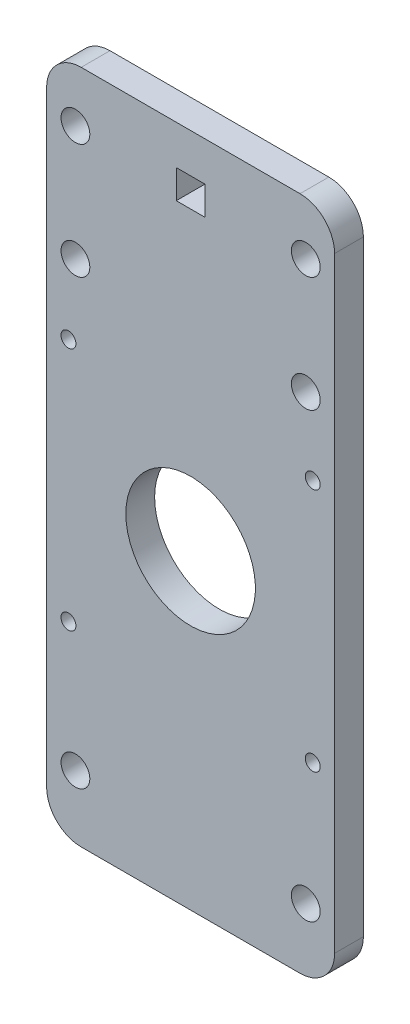
ISO-10303-21;
HEADER;
FILE_DESCRIPTION(('STEP AP214'),'2;1');
FILE_NAME('part.step','',(''),(''),'','','');
FILE_SCHEMA(('AUTOMOTIVE_DESIGN { 1 0 10303 214 1 1 1 1 }'));
ENDSEC;
DATA;
#1=APPLICATION_CONTEXT('core data for automotive mechanical design processes');
#2=APPLICATION_PROTOCOL_DEFINITION('international standard','automotive_design',2000,#1);
#3=PRODUCT_CONTEXT('',#1,'mechanical');
#4=PRODUCT('Part','Part','',(#3));
#5=PRODUCT_RELATED_PRODUCT_CATEGORY('part','',(#4));
#6=PRODUCT_DEFINITION_FORMATION('','',#4);
#7=PRODUCT_DEFINITION_CONTEXT('part definition',#1,'design');
#8=PRODUCT_DEFINITION('design','',#6,#7);
#9=PRODUCT_DEFINITION_SHAPE('','',#8);
#10=(LENGTH_UNIT() NAMED_UNIT(*) SI_UNIT(.MILLI.,.METRE.));
#11=(NAMED_UNIT(*) PLANE_ANGLE_UNIT() SI_UNIT($,.RADIAN.));
#12=(NAMED_UNIT(*) SI_UNIT($,.STERADIAN.) SOLID_ANGLE_UNIT());
#13=UNCERTAINTY_MEASURE_WITH_UNIT(LENGTH_MEASURE(1.E-05),#10,'distance_accuracy_value','');
#14=(GEOMETRIC_REPRESENTATION_CONTEXT(3) GLOBAL_UNCERTAINTY_ASSIGNED_CONTEXT((#13)) GLOBAL_UNIT_ASSIGNED_CONTEXT((#10,
#11,#12)) REPRESENTATION_CONTEXT('',''));
#15=CARTESIAN_POINT('',(0.,0.,0.));
#16=DIRECTION('',(0.,0.,1.));
#17=DIRECTION('',(1.,0.,0.));
#18=AXIS2_PLACEMENT_3D('',#15,#16,#17);
#19=CARTESIAN_POINT('',(-18.1,-22.0973062704397,-6.35));
#20=DIRECTION('',(0.,0.,-1.));
#21=DIRECTION('',(-1.,0.,0.));
#22=AXIS2_PLACEMENT_3D('',#19,#20,#21);
#23=PLANE('',#22);
#24=CARTESIAN_POINT('',(-26.9400000000001,44.8247845003733,-6.35));
#25=DIRECTION('',(0.,0.,1.));
#26=DIRECTION('',(1.,0.,0.));
#27=AXIS2_PLACEMENT_3D('',#24,#25,#26);
#28=CIRCLE('',#27,1.65);
#29=CARTESIAN_POINT('',(-25.2900000000001,44.8247845003733,-6.35));
#30=VERTEX_POINT('',#29);
#31=EDGE_CURVE('E575',#30,#30,#28,.T.);
#32=ORIENTED_EDGE('',*,*,#31,.T.);
#33=EDGE_LOOP('',(#32));
#34=FACE_BOUND('',#33,.T.);
#35=CARTESIAN_POINT('',(26.9400000000003,-9.05598381762616,-6.35));
#36=DIRECTION('',(0.,0.,1.));
#37=DIRECTION('',(1.,0.,0.));
#38=AXIS2_PLACEMENT_3D('',#35,#36,#37);
#39=CIRCLE('',#38,1.65);
#40=CARTESIAN_POINT('',(28.5900000000003,-9.05598381762616,-6.35));
#41=VERTEX_POINT('',#40);
#42=EDGE_CURVE('E587',#41,#41,#39,.T.);
#43=ORIENTED_EDGE('',*,*,#42,.T.);
#44=EDGE_LOOP('',(#43));
#45=FACE_BOUND('',#44,.T.);
#46=CARTESIAN_POINT('',(-26.9399999999997,-9.05598381762672,-6.35));
#47=DIRECTION('',(0.,0.,1.));
#48=DIRECTION('',(1.,0.,0.));
#49=AXIS2_PLACEMENT_3D('',#46,#47,#48);
#50=CIRCLE('',#49,1.65);
#51=CARTESIAN_POINT('',(-25.2899999999997,-9.05598381762672,-6.35));
#52=VERTEX_POINT('',#51);
#53=EDGE_CURVE('E581',#52,#52,#50,.T.);
#54=ORIENTED_EDGE('',*,*,#53,.T.);
#55=EDGE_LOOP('',(#54));
#56=FACE_BOUND('',#55,.T.);
#57=CARTESIAN_POINT('',(26.9399999999999,44.8247845003738,-6.35));
#58=DIRECTION('',(0.,0.,1.));
#59=DIRECTION('',(1.,0.,0.));
#60=AXIS2_PLACEMENT_3D('',#57,#58,#59);
#61=CIRCLE('',#60,1.65);
#62=CARTESIAN_POINT('',(28.5899999999999,44.8247845003738,-6.35));
#63=VERTEX_POINT('',#62);
#64=EDGE_CURVE('E569',#63,#63,#61,.T.);
#65=ORIENTED_EDGE('',*,*,#64,.T.);
#66=EDGE_LOOP('',(#65));
#67=FACE_BOUND('',#66,.T.);
#68=CARTESIAN_POINT('',(0.,17.8847845003735,-6.35));
#69=DIRECTION('',(0.,0.,-1.));
#70=DIRECTION('',(-1.,0.,0.));
#71=AXIS2_PLACEMENT_3D('',#68,#69,#70);
#72=CIRCLE('',#71,14.2875);
#73=CARTESIAN_POINT('',(-14.2875,17.8847845003735,-6.35));
#74=VERTEX_POINT('',#73);
#75=EDGE_CURVE('E172',#74,#74,#72,.T.);
#76=ORIENTED_EDGE('',*,*,#75,.F.);
#77=EDGE_LOOP('',(#76));
#78=FACE_BOUND('',#77,.T.);
#79=CARTESIAN_POINT('',(-25.4000000000007,-36.7252154996265,-6.35));
#80=DIRECTION('',(0.,0.,-1.));
#81=DIRECTION('',(-1.,0.,0.));
#82=AXIS2_PLACEMENT_3D('',#79,#80,#81);
#83=CIRCLE('',#82,3.175);
#84=CARTESIAN_POINT('',(-28.5750000000007,-36.7252154996265,-6.35));
#85=VERTEX_POINT('',#84);
#86=EDGE_CURVE('E178',#85,#85,#83,.T.);
#87=ORIENTED_EDGE('',*,*,#86,.F.);
#88=EDGE_LOOP('',(#87));
#89=FACE_BOUND('',#88,.T.);
#90=CARTESIAN_POINT('',(25.3999999999993,-36.7252154996269,-6.35));
#91=DIRECTION('',(0.,0.,-1.));
#92=DIRECTION('',(-1.,0.,0.));
#93=AXIS2_PLACEMENT_3D('',#90,#91,#92);
#94=CIRCLE('',#93,3.175);
#95=CARTESIAN_POINT('',(22.2249999999993,-36.7252154996269,-6.35));
#96=VERTEX_POINT('',#95);
#97=EDGE_CURVE('E184',#96,#96,#94,.T.);
#98=ORIENTED_EDGE('',*,*,#97,.F.);
#99=EDGE_LOOP('',(#98));
#100=FACE_BOUND('',#99,.T.);
#101=DIRECTION('',(-1.,0.,0.));
#102=VECTOR('',#101,1.);
#103=CARTESIAN_POINT('',(31.75,-50.6952154996265,-6.35));
#104=LINE('',#103,#102);
#105=CARTESIAN_POINT('',(24.13,-50.6952154996265,-6.35));
#106=VERTEX_POINT('',#105);
#107=CARTESIAN_POINT('',(-24.13,-50.6952154996265,-6.35));
#108=VERTEX_POINT('',#107);
#109=EDGE_CURVE('E197',#106,#108,#104,.T.);
#110=ORIENTED_EDGE('',*,*,#109,.T.);
#111=CARTESIAN_POINT('',(-24.13,-43.0752154996265,-6.35));
#112=DIRECTION('',(0.,0.,-1.));
#113=DIRECTION('',(-1.,0.,0.));
#114=AXIS2_PLACEMENT_3D('',#111,#112,#113);
#115=CIRCLE('',#114,7.62);
#116=CARTESIAN_POINT('',(-31.75,-43.0752154996265,-6.35));
#117=VERTEX_POINT('',#116);
#118=EDGE_CURVE('E221',#108,#117,#115,.T.);
#119=ORIENTED_EDGE('',*,*,#118,.T.);
#120=DIRECTION('',(0.,1.,0.));
#121=VECTOR('',#120,1.);
#122=CARTESIAN_POINT('',(-31.75,38.2047845003735,-6.35));
#123=LINE('',#122,#121);
#124=CARTESIAN_POINT('',(-31.75,90.5847845003735,-6.35));
#125=VERTEX_POINT('',#124);
#126=EDGE_CURVE('E190',#117,#125,#123,.T.);
#127=ORIENTED_EDGE('',*,*,#126,.T.);
#128=CARTESIAN_POINT('',(-24.13,90.5847845003735,-6.35));
#129=DIRECTION('',(0.,0.,-1.));
#130=DIRECTION('',(-1.,0.,0.));
#131=AXIS2_PLACEMENT_3D('',#128,#129,#130);
#132=CIRCLE('',#131,7.62);
#133=CARTESIAN_POINT('',(-24.13,98.2047845003734,-6.35));
#134=VERTEX_POINT('',#133);
#135=EDGE_CURVE('E217',#125,#134,#132,.T.);
#136=ORIENTED_EDGE('',*,*,#135,.T.);
#137=DIRECTION('',(1.,0.,0.));
#138=VECTOR('',#137,1.);
#139=CARTESIAN_POINT('',(31.75,98.2047845003734,-6.35));
#140=LINE('',#139,#138);
#141=CARTESIAN_POINT('',(24.13,98.2047845003734,-6.35));
#142=VERTEX_POINT('',#141);
#143=EDGE_CURVE('E166',#134,#142,#140,.T.);
#144=ORIENTED_EDGE('',*,*,#143,.T.);
#145=CARTESIAN_POINT('',(24.13,90.5847845003735,-6.35));
#146=DIRECTION('',(0.,0.,-1.));
#147=DIRECTION('',(-1.,0.,0.));
#148=AXIS2_PLACEMENT_3D('',#145,#146,#147);
#149=CIRCLE('',#148,7.62);
#150=CARTESIAN_POINT('',(31.75,90.5847845003735,-6.35));
#151=VERTEX_POINT('',#150);
#152=EDGE_CURVE('E215',#142,#151,#149,.T.);
#153=ORIENTED_EDGE('',*,*,#152,.T.);
#154=DIRECTION('',(0.,-1.,0.));
#155=VECTOR('',#154,1.);
#156=CARTESIAN_POINT('',(31.75,38.2047845003735,-6.35));
#157=LINE('',#156,#155);
#158=CARTESIAN_POINT('',(31.75,-43.0752154996265,-6.35));
#159=VERTEX_POINT('',#158);
#160=EDGE_CURVE('E206',#151,#159,#157,.T.);
#161=ORIENTED_EDGE('',*,*,#160,.T.);
#162=CARTESIAN_POINT('',(24.13,-43.0752154996265,-6.35));
#163=DIRECTION('',(0.,0.,-1.));
#164=DIRECTION('',(-1.,0.,0.));
#165=AXIS2_PLACEMENT_3D('',#162,#163,#164);
#166=CIRCLE('',#165,7.62);
#167=EDGE_CURVE('E219',#159,#106,#166,.T.);
#168=ORIENTED_EDGE('',*,*,#167,.T.);
#169=EDGE_LOOP('',(#110,#119,#127,#136,#144,#153,#161,#168));
#170=FACE_BOUND('',#169,.T.);
#171=CARTESIAN_POINT('',(-25.4,86.3797845003735,-6.35));
#172=DIRECTION('',(0.,0.,-1.));
#173=DIRECTION('',(1.,0.,0.));
#174=AXIS2_PLACEMENT_3D('',#171,#172,#173);
#175=CIRCLE('',#174,3.175);
#176=CARTESIAN_POINT('',(-22.225,86.3797845003735,-6.35));
#177=VERTEX_POINT('',#176);
#178=EDGE_CURVE('E566',#177,#177,#175,.T.);
#179=ORIENTED_EDGE('',*,*,#178,.F.);
#180=EDGE_LOOP('',(#179));
#181=FACE_BOUND('',#180,.T.);
#182=CARTESIAN_POINT('',(25.3999999999997,60.9797845003735,-6.35));
#183=DIRECTION('',(0.,0.,-1.));
#184=DIRECTION('',(-1.,0.,0.));
#185=AXIS2_PLACEMENT_3D('',#182,#183,#184);
#186=CIRCLE('',#185,3.175);
#187=CARTESIAN_POINT('',(22.2249999999997,60.9797845003735,-6.35));
#188=VERTEX_POINT('',#187);
#189=EDGE_CURVE('E560',#188,#188,#186,.T.);
#190=ORIENTED_EDGE('',*,*,#189,.F.);
#191=EDGE_LOOP('',(#190));
#192=FACE_BOUND('',#191,.T.);
#193=CARTESIAN_POINT('',(-25.3999999999997,60.9797845003735,-6.35));
#194=DIRECTION('',(0.,0.,-1.));
#195=DIRECTION('',(1.,0.,0.));
#196=AXIS2_PLACEMENT_3D('',#193,#194,#195);
#197=CIRCLE('',#196,3.175);
#198=CARTESIAN_POINT('',(-22.2249999999997,60.9797845003735,-6.35));
#199=VERTEX_POINT('',#198);
#200=EDGE_CURVE('E552',#199,#199,#197,.T.);
#201=ORIENTED_EDGE('',*,*,#200,.F.);
#202=EDGE_LOOP('',(#201));
#203=FACE_BOUND('',#202,.T.);
#204=CARTESIAN_POINT('',(25.4,86.3797845003735,-6.35));
#205=DIRECTION('',(0.,0.,-1.));
#206=DIRECTION('',(-1.,0.,0.));
#207=AXIS2_PLACEMENT_3D('',#204,#205,#206);
#208=CIRCLE('',#207,3.175);
#209=CARTESIAN_POINT('',(22.225,86.3797845003735,-6.35));
#210=VERTEX_POINT('',#209);
#211=EDGE_CURVE('E153',#210,#210,#208,.T.);
#212=ORIENTED_EDGE('',*,*,#211,.F.);
#213=EDGE_LOOP('',(#212));
#214=FACE_BOUND('',#213,.T.);
#215=DIRECTION('',(-1.,0.,0.));
#216=VECTOR('',#215,1.);
#217=CARTESIAN_POINT('',(-3.165,83.2147845003735,-6.35));
#218=LINE('',#217,#216);
#219=CARTESIAN_POINT('',(3.165,83.2147845003735,-6.35));
#220=VERTEX_POINT('',#219);
#221=CARTESIAN_POINT('',(-3.165,83.2147845003735,-6.35));
#222=VERTEX_POINT('',#221);
#223=EDGE_CURVE('E159',#220,#222,#218,.T.);
#224=ORIENTED_EDGE('',*,*,#223,.F.);
#225=DIRECTION('',(0.,-1.,0.));
#226=VECTOR('',#225,1.);
#227=CARTESIAN_POINT('',(3.165,89.5447845003735,-6.35));
#228=LINE('',#227,#226);
#229=CARTESIAN_POINT('',(3.165,89.5447845003735,-6.35));
#230=VERTEX_POINT('',#229);
#231=EDGE_CURVE('E130',#230,#220,#228,.T.);
#232=ORIENTED_EDGE('',*,*,#231,.F.);
#233=DIRECTION('',(1.,0.,0.));
#234=VECTOR('',#233,1.);
#235=CARTESIAN_POINT('',(-3.165,89.5447845003735,-6.35));
#236=LINE('',#235,#234);
#237=CARTESIAN_POINT('',(-3.165,89.5447845003735,-6.35));
#238=VERTEX_POINT('',#237);
#239=EDGE_CURVE('E147',#238,#230,#236,.T.);
#240=ORIENTED_EDGE('',*,*,#239,.F.);
#241=DIRECTION('',(0.,1.,0.));
#242=VECTOR('',#241,1.);
#243=CARTESIAN_POINT('',(-3.165,89.5447845003735,-6.35));
#244=LINE('',#243,#242);
#245=EDGE_CURVE('E150',#222,#238,#244,.T.);
#246=ORIENTED_EDGE('',*,*,#245,.F.);
#247=EDGE_LOOP('',(#224,#232,#240,#246));
#248=FACE_BOUND('',#247,.T.);
#249=ADVANCED_FACE('F34',(#34,#45,#56,#67,#78,#89,#100,#170,#181,#192,#203,#214,#248),#23,.T.);
#250=CARTESIAN_POINT('',(-18.1,-22.0973062704397,0.));
#251=DIRECTION('',(0.,0.,-1.));
#252=DIRECTION('',(-1.,0.,0.));
#253=AXIS2_PLACEMENT_3D('',#250,#251,#252);
#254=PLANE('',#253);
#255=CARTESIAN_POINT('',(-26.9400000000001,44.8247845003733,0.));
#256=DIRECTION('',(0.,0.,1.));
#257=DIRECTION('',(1.,0.,0.));
#258=AXIS2_PLACEMENT_3D('',#255,#256,#257);
#259=CIRCLE('',#258,1.65);
#260=CARTESIAN_POINT('',(-25.2900000000001,44.8247845003733,0.));
#261=VERTEX_POINT('',#260);
#262=EDGE_CURVE('E590',#261,#261,#259,.T.);
#263=ORIENTED_EDGE('',*,*,#262,.F.);
#264=EDGE_LOOP('',(#263));
#265=FACE_BOUND('',#264,.T.);
#266=CARTESIAN_POINT('',(26.9400000000003,-9.05598381762616,0.));
#267=DIRECTION('',(0.,0.,1.));
#268=DIRECTION('',(1.,0.,0.));
#269=AXIS2_PLACEMENT_3D('',#266,#267,#268);
#270=CIRCLE('',#269,1.65);
#271=CARTESIAN_POINT('',(28.5900000000003,-9.05598381762616,0.));
#272=VERTEX_POINT('',#271);
#273=EDGE_CURVE('E584',#272,#272,#270,.T.);
#274=ORIENTED_EDGE('',*,*,#273,.F.);
#275=EDGE_LOOP('',(#274));
#276=FACE_BOUND('',#275,.T.);
#277=CARTESIAN_POINT('',(-26.9399999999997,-9.05598381762672,0.));
#278=DIRECTION('',(0.,0.,1.));
#279=DIRECTION('',(1.,0.,0.));
#280=AXIS2_PLACEMENT_3D('',#277,#278,#279);
#281=CIRCLE('',#280,1.65);
#282=CARTESIAN_POINT('',(-25.2899999999997,-9.05598381762672,0.));
#283=VERTEX_POINT('',#282);
#284=EDGE_CURVE('E578',#283,#283,#281,.T.);
#285=ORIENTED_EDGE('',*,*,#284,.F.);
#286=EDGE_LOOP('',(#285));
#287=FACE_BOUND('',#286,.T.);
#288=CARTESIAN_POINT('',(26.9399999999999,44.8247845003738,0.));
#289=DIRECTION('',(0.,0.,1.));
#290=DIRECTION('',(1.,0.,0.));
#291=AXIS2_PLACEMENT_3D('',#288,#289,#290);
#292=CIRCLE('',#291,1.65);
#293=CARTESIAN_POINT('',(28.5899999999999,44.8247845003738,0.));
#294=VERTEX_POINT('',#293);
#295=EDGE_CURVE('E572',#294,#294,#292,.T.);
#296=ORIENTED_EDGE('',*,*,#295,.F.);
#297=EDGE_LOOP('',(#296));
#298=FACE_BOUND('',#297,.T.);
#299=CARTESIAN_POINT('',(0.,17.8847845003735,0.));
#300=DIRECTION('',(0.,0.,-1.));
#301=DIRECTION('',(-1.,0.,0.));
#302=AXIS2_PLACEMENT_3D('',#299,#300,#301);
#303=CIRCLE('',#302,14.2875);
#304=CARTESIAN_POINT('',(-14.2875,17.8847845003735,0.));
#305=VERTEX_POINT('',#304);
#306=EDGE_CURVE('E175',#305,#305,#303,.T.);
#307=ORIENTED_EDGE('',*,*,#306,.T.);
#308=EDGE_LOOP('',(#307));
#309=FACE_BOUND('',#308,.T.);
#310=CARTESIAN_POINT('',(-25.4000000000007,-36.7252154996265,0.));
#311=DIRECTION('',(0.,0.,-1.));
#312=DIRECTION('',(-1.,0.,0.));
#313=AXIS2_PLACEMENT_3D('',#310,#311,#312);
#314=CIRCLE('',#313,3.175);
#315=CARTESIAN_POINT('',(-28.5750000000007,-36.7252154996265,0.));
#316=VERTEX_POINT('',#315);
#317=EDGE_CURVE('E181',#316,#316,#314,.T.);
#318=ORIENTED_EDGE('',*,*,#317,.T.);
#319=EDGE_LOOP('',(#318));
#320=FACE_BOUND('',#319,.T.);
#321=CARTESIAN_POINT('',(25.3999999999993,-36.7252154996269,0.));
#322=DIRECTION('',(0.,0.,-1.));
#323=DIRECTION('',(-1.,0.,0.));
#324=AXIS2_PLACEMENT_3D('',#321,#322,#323);
#325=CIRCLE('',#324,3.175);
#326=CARTESIAN_POINT('',(22.2249999999993,-36.7252154996269,0.));
#327=VERTEX_POINT('',#326);
#328=EDGE_CURVE('E187',#327,#327,#325,.T.);
#329=ORIENTED_EDGE('',*,*,#328,.T.);
#330=EDGE_LOOP('',(#329));
#331=FACE_BOUND('',#330,.T.);
#332=DIRECTION('',(0.,1.,0.));
#333=VECTOR('',#332,1.);
#334=CARTESIAN_POINT('',(-31.75,38.2047845003735,0.));
#335=LINE('',#334,#333);
#336=CARTESIAN_POINT('',(-31.75,-43.0752154996265,0.));
#337=VERTEX_POINT('',#336);
#338=CARTESIAN_POINT('',(-31.75,90.5847845003735,0.));
#339=VERTEX_POINT('',#338);
#340=EDGE_CURVE('E193',#337,#339,#335,.T.);
#341=ORIENTED_EDGE('',*,*,#340,.F.);
#342=CARTESIAN_POINT('',(-24.13,-43.0752154996265,0.));
#343=DIRECTION('',(0.,0.,-1.));
#344=DIRECTION('',(-1.,0.,0.));
#345=AXIS2_PLACEMENT_3D('',#342,#343,#344);
#346=CIRCLE('',#345,7.62);
#347=CARTESIAN_POINT('',(-24.13,-50.6952154996265,0.));
#348=VERTEX_POINT('',#347);
#349=EDGE_CURVE('E233',#337,#348,#346,.F.);
#350=ORIENTED_EDGE('',*,*,#349,.T.);
#351=DIRECTION('',(-1.,0.,0.));
#352=VECTOR('',#351,1.);
#353=CARTESIAN_POINT('',(31.75,-50.6952154996265,0.));
#354=LINE('',#353,#352);
#355=CARTESIAN_POINT('',(24.13,-50.6952154996265,0.));
#356=VERTEX_POINT('',#355);
#357=EDGE_CURVE('E200',#356,#348,#354,.T.);
#358=ORIENTED_EDGE('',*,*,#357,.F.);
#359=CARTESIAN_POINT('',(24.13,-43.0752154996265,0.));
#360=DIRECTION('',(0.,0.,-1.));
#361=DIRECTION('',(-1.,0.,0.));
#362=AXIS2_PLACEMENT_3D('',#359,#360,#361);
#363=CIRCLE('',#362,7.62);
#364=CARTESIAN_POINT('',(31.75,-43.0752154996265,0.));
#365=VERTEX_POINT('',#364);
#366=EDGE_CURVE('E231',#356,#365,#363,.F.);
#367=ORIENTED_EDGE('',*,*,#366,.T.);
#368=DIRECTION('',(0.,-1.,0.));
#369=VECTOR('',#368,1.);
#370=CARTESIAN_POINT('',(31.75,38.2047845003735,0.));
#371=LINE('',#370,#369);
#372=CARTESIAN_POINT('',(31.75,90.5847845003735,0.));
#373=VERTEX_POINT('',#372);
#374=EDGE_CURVE('E196',#373,#365,#371,.T.);
#375=ORIENTED_EDGE('',*,*,#374,.F.);
#376=CARTESIAN_POINT('',(24.13,90.5847845003735,0.));
#377=DIRECTION('',(0.,0.,-1.));
#378=DIRECTION('',(-1.,0.,0.));
#379=AXIS2_PLACEMENT_3D('',#376,#377,#378);
#380=CIRCLE('',#379,7.62);
#381=CARTESIAN_POINT('',(24.13,98.2047845003734,0.));
#382=VERTEX_POINT('',#381);
#383=EDGE_CURVE('E49',#373,#382,#380,.F.);
#384=ORIENTED_EDGE('',*,*,#383,.T.);
#385=DIRECTION('',(1.,0.,0.));
#386=VECTOR('',#385,1.);
#387=CARTESIAN_POINT('',(31.75,98.2047845003734,0.));
#388=LINE('',#387,#386);
#389=CARTESIAN_POINT('',(-24.13,98.2047845003734,0.));
#390=VERTEX_POINT('',#389);
#391=EDGE_CURVE('E170',#390,#382,#388,.T.);
#392=ORIENTED_EDGE('',*,*,#391,.F.);
#393=CARTESIAN_POINT('',(-24.13,90.5847845003735,0.));
#394=DIRECTION('',(0.,0.,-1.));
#395=DIRECTION('',(-1.,0.,0.));
#396=AXIS2_PLACEMENT_3D('',#393,#394,#395);
#397=CIRCLE('',#396,7.62);
#398=EDGE_CURVE('E229',#390,#339,#397,.F.);
#399=ORIENTED_EDGE('',*,*,#398,.T.);
#400=EDGE_LOOP('',(#341,#350,#358,#367,#375,#384,#392,#399));
#401=FACE_BOUND('',#400,.T.);
#402=CARTESIAN_POINT('',(-25.4,86.3797845003735,0.));
#403=DIRECTION('',(0.,0.,-1.));
#404=DIRECTION('',(1.,0.,0.));
#405=AXIS2_PLACEMENT_3D('',#402,#403,#404);
#406=CIRCLE('',#405,3.175);
#407=CARTESIAN_POINT('',(-22.225,86.3797845003735,0.));
#408=VERTEX_POINT('',#407);
#409=EDGE_CURVE('E563',#408,#408,#406,.T.);
#410=ORIENTED_EDGE('',*,*,#409,.T.);
#411=EDGE_LOOP('',(#410));
#412=FACE_BOUND('',#411,.T.);
#413=CARTESIAN_POINT('',(25.3999999999997,60.9797845003735,0.));
#414=DIRECTION('',(0.,0.,-1.));
#415=DIRECTION('',(-1.,0.,0.));
#416=AXIS2_PLACEMENT_3D('',#413,#414,#415);
#417=CIRCLE('',#416,3.175);
#418=CARTESIAN_POINT('',(22.2249999999997,60.9797845003735,0.));
#419=VERTEX_POINT('',#418);
#420=EDGE_CURVE('E557',#419,#419,#417,.T.);
#421=ORIENTED_EDGE('',*,*,#420,.T.);
#422=EDGE_LOOP('',(#421));
#423=FACE_BOUND('',#422,.T.);
#424=CARTESIAN_POINT('',(-25.3999999999997,60.9797845003735,0.));
#425=DIRECTION('',(0.,0.,-1.));
#426=DIRECTION('',(1.,0.,0.));
#427=AXIS2_PLACEMENT_3D('',#424,#425,#426);
#428=CIRCLE('',#427,3.175);
#429=CARTESIAN_POINT('',(-22.2249999999997,60.9797845003735,0.));
#430=VERTEX_POINT('',#429);
#431=EDGE_CURVE('E550',#430,#430,#428,.T.);
#432=ORIENTED_EDGE('',*,*,#431,.T.);
#433=EDGE_LOOP('',(#432));
#434=FACE_BOUND('',#433,.T.);
#435=CARTESIAN_POINT('',(25.4,86.3797845003735,0.));
#436=DIRECTION('',(0.,0.,-1.));
#437=DIRECTION('',(-1.,0.,0.));
#438=AXIS2_PLACEMENT_3D('',#435,#436,#437);
#439=CIRCLE('',#438,3.175);
#440=CARTESIAN_POINT('',(22.225,86.3797845003735,0.));
#441=VERTEX_POINT('',#440);
#442=EDGE_CURVE('E160',#441,#441,#439,.T.);
#443=ORIENTED_EDGE('',*,*,#442,.T.);
#444=EDGE_LOOP('',(#443));
#445=FACE_BOUND('',#444,.T.);
#446=DIRECTION('',(0.,-1.,0.));
#447=VECTOR('',#446,1.);
#448=CARTESIAN_POINT('',(3.165,89.5447845003735,0.));
#449=LINE('',#448,#447);
#450=CARTESIAN_POINT('',(3.165,89.5447845003735,0.));
#451=VERTEX_POINT('',#450);
#452=CARTESIAN_POINT('',(3.165,83.2147845003735,0.));
#453=VERTEX_POINT('',#452);
#454=EDGE_CURVE('E127',#451,#453,#449,.T.);
#455=ORIENTED_EDGE('',*,*,#454,.T.);
#456=DIRECTION('',(-1.,0.,0.));
#457=VECTOR('',#456,1.);
#458=CARTESIAN_POINT('',(-3.165,83.2147845003735,0.));
#459=LINE('',#458,#457);
#460=CARTESIAN_POINT('',(-3.165,83.2147845003735,0.));
#461=VERTEX_POINT('',#460);
#462=EDGE_CURVE('E139',#453,#461,#459,.T.);
#463=ORIENTED_EDGE('',*,*,#462,.T.);
#464=DIRECTION('',(0.,1.,0.));
#465=VECTOR('',#464,1.);
#466=CARTESIAN_POINT('',(-3.165,89.5447845003735,0.));
#467=LINE('',#466,#465);
#468=CARTESIAN_POINT('',(-3.165,89.5447845003735,0.));
#469=VERTEX_POINT('',#468);
#470=EDGE_CURVE('E143',#461,#469,#467,.T.);
#471=ORIENTED_EDGE('',*,*,#470,.T.);
#472=DIRECTION('',(1.,0.,0.));
#473=VECTOR('',#472,1.);
#474=CARTESIAN_POINT('',(-3.165,89.5447845003735,0.));
#475=LINE('',#474,#473);
#476=EDGE_CURVE('E135',#469,#451,#475,.T.);
#477=ORIENTED_EDGE('',*,*,#476,.T.);
#478=EDGE_LOOP('',(#455,#463,#471,#477));
#479=FACE_BOUND('',#478,.T.);
#480=ADVANCED_FACE('F145',(#265,#276,#287,#298,#309,#320,#331,#401,#412,#423,#434,#445,#479),
#254,.F.);
#481=CARTESIAN_POINT('',(-31.75,38.2047845003735,0.));
#482=DIRECTION('',(-1.,0.,0.));
#483=DIRECTION('',(0.,-1.,0.));
#484=AXIS2_PLACEMENT_3D('',#481,#482,#483);
#485=PLANE('',#484);
#486=ORIENTED_EDGE('',*,*,#126,.F.);
#487=DIRECTION('',(0.,0.,-1.));
#488=VECTOR('',#487,1.);
#489=CARTESIAN_POINT('',(-31.75,-43.0752154996265,0.));
#490=LINE('',#489,#488);
#491=EDGE_CURVE('E226',#117,#337,#490,.F.);
#492=ORIENTED_EDGE('',*,*,#491,.T.);
#493=ORIENTED_EDGE('',*,*,#340,.T.);
#494=DIRECTION('',(0.,0.,-1.));
#495=VECTOR('',#494,1.);
#496=CARTESIAN_POINT('',(-31.75,90.5847845003735,0.));
#497=LINE('',#496,#495);
#498=EDGE_CURVE('E223',#339,#125,#497,.T.);
#499=ORIENTED_EDGE('',*,*,#498,.T.);
#500=EDGE_LOOP('',(#486,#492,#493,#499));
#501=FACE_BOUND('',#500,.T.);
#502=ADVANCED_FACE('F252',(#501),#485,.T.);
#503=CARTESIAN_POINT('',(31.75,-50.6952154996265,0.));
#504=DIRECTION('',(0.,-1.,0.));
#505=DIRECTION('',(1.,0.,0.));
#506=AXIS2_PLACEMENT_3D('',#503,#504,#505);
#507=PLANE('',#506);
#508=ORIENTED_EDGE('',*,*,#357,.T.);
#509=DIRECTION('',(0.,0.,-1.));
#510=VECTOR('',#509,1.);
#511=CARTESIAN_POINT('',(-24.13,-50.6952154996265,0.));
#512=LINE('',#511,#510);
#513=EDGE_CURVE('E212',#348,#108,#512,.T.);
#514=ORIENTED_EDGE('',*,*,#513,.T.);
#515=ORIENTED_EDGE('',*,*,#109,.F.);
#516=DIRECTION('',(0.,0.,-1.));
#517=VECTOR('',#516,1.);
#518=CARTESIAN_POINT('',(24.13,-50.6952154996265,0.));
#519=LINE('',#518,#517);
#520=EDGE_CURVE('E203',#106,#356,#519,.F.);
#521=ORIENTED_EDGE('',*,*,#520,.T.);
#522=EDGE_LOOP('',(#508,#514,#515,#521));
#523=FACE_BOUND('',#522,.T.);
#524=ADVANCED_FACE('F263',(#523),#507,.T.);
#525=CARTESIAN_POINT('',(31.75,38.2047845003735,0.));
#526=DIRECTION('',(1.,0.,0.));
#527=DIRECTION('',(0.,1.,0.));
#528=AXIS2_PLACEMENT_3D('',#525,#526,#527);
#529=PLANE('',#528);
#530=ORIENTED_EDGE('',*,*,#374,.T.);
#531=DIRECTION('',(0.,0.,-1.));
#532=VECTOR('',#531,1.);
#533=CARTESIAN_POINT('',(31.75,-43.0752154996265,0.));
#534=LINE('',#533,#532);
#535=EDGE_CURVE('E237',#365,#159,#534,.T.);
#536=ORIENTED_EDGE('',*,*,#535,.T.);
#537=ORIENTED_EDGE('',*,*,#160,.F.);
#538=DIRECTION('',(0.,0.,-1.));
#539=VECTOR('',#538,1.);
#540=CARTESIAN_POINT('',(31.75,90.5847845003735,0.));
#541=LINE('',#540,#539);
#542=EDGE_CURVE('E235',#151,#373,#541,.F.);
#543=ORIENTED_EDGE('',*,*,#542,.T.);
#544=EDGE_LOOP('',(#530,#536,#537,#543));
#545=FACE_BOUND('',#544,.T.);
#546=ADVANCED_FACE('F270',(#545),#529,.T.);
#547=CARTESIAN_POINT('',(25.3999999999993,-36.7252154996269,0.));
#548=DIRECTION('',(0.,0.,-1.));
#549=DIRECTION('',(-1.,0.,0.));
#550=AXIS2_PLACEMENT_3D('',#547,#548,#549);
#551=CYLINDRICAL_SURFACE('',#550,3.175);
#552=ORIENTED_EDGE('',*,*,#328,.F.);
#553=EDGE_LOOP('',(#552));
#554=FACE_BOUND('',#553,.T.);
#555=ORIENTED_EDGE('',*,*,#97,.T.);
#556=EDGE_LOOP('',(#555));
#557=FACE_BOUND('',#556,.T.);
#558=ADVANCED_FACE('F403',(#554,#557),#551,.F.);
#559=CARTESIAN_POINT('',(-25.4000000000007,-36.7252154996265,0.));
#560=DIRECTION('',(0.,0.,-1.));
#561=DIRECTION('',(-1.,0.,0.));
#562=AXIS2_PLACEMENT_3D('',#559,#560,#561);
#563=CYLINDRICAL_SURFACE('',#562,3.175);
#564=ORIENTED_EDGE('',*,*,#317,.F.);
#565=EDGE_LOOP('',(#564));
#566=FACE_BOUND('',#565,.T.);
#567=ORIENTED_EDGE('',*,*,#86,.T.);
#568=EDGE_LOOP('',(#567));
#569=FACE_BOUND('',#568,.T.);
#570=ADVANCED_FACE('F399',(#566,#569),#563,.F.);
#571=CARTESIAN_POINT('',(0.,17.8847845003735,0.));
#572=DIRECTION('',(0.,0.,-1.));
#573=DIRECTION('',(-1.,0.,0.));
#574=AXIS2_PLACEMENT_3D('',#571,#572,#573);
#575=CYLINDRICAL_SURFACE('',#574,14.2875);
#576=ORIENTED_EDGE('',*,*,#306,.F.);
#577=EDGE_LOOP('',(#576));
#578=FACE_BOUND('',#577,.T.);
#579=ORIENTED_EDGE('',*,*,#75,.T.);
#580=EDGE_LOOP('',(#579));
#581=FACE_BOUND('',#580,.T.);
#582=ADVANCED_FACE('F396',(#578,#581),#575,.F.);
#583=CARTESIAN_POINT('',(31.75,98.2047845003734,0.));
#584=DIRECTION('',(0.,1.,0.));
#585=DIRECTION('',(0.,0.,1.));
#586=AXIS2_PLACEMENT_3D('',#583,#584,#585);
#587=PLANE('',#586);
#588=ORIENTED_EDGE('',*,*,#143,.F.);
#589=DIRECTION('',(0.,0.,-1.));
#590=VECTOR('',#589,1.);
#591=CARTESIAN_POINT('',(-24.13,98.2047845003734,0.));
#592=LINE('',#591,#590);
#593=EDGE_CURVE('E11',#134,#390,#592,.F.);
#594=ORIENTED_EDGE('',*,*,#593,.T.);
#595=ORIENTED_EDGE('',*,*,#391,.T.);
#596=DIRECTION('',(0.,0.,-1.));
#597=VECTOR('',#596,1.);
#598=CARTESIAN_POINT('',(24.13,98.2047845003734,0.));
#599=LINE('',#598,#597);
#600=EDGE_CURVE('E42',#382,#142,#599,.T.);
#601=ORIENTED_EDGE('',*,*,#600,.T.);
#602=EDGE_LOOP('',(#588,#594,#595,#601));
#603=FACE_BOUND('',#602,.T.);
#604=ADVANCED_FACE('F241',(#603),#587,.T.);
#605=CARTESIAN_POINT('',(3.165,89.5447845003735,0.));
#606=DIRECTION('',(1.,0.,0.));
#607=DIRECTION('',(0.,1.,0.));
#608=AXIS2_PLACEMENT_3D('',#605,#606,#607);
#609=PLANE('',#608);
#610=ORIENTED_EDGE('',*,*,#231,.T.);
#611=DIRECTION('',(0.,0.,-1.));
#612=VECTOR('',#611,1.);
#613=CARTESIAN_POINT('',(3.165,83.2147845003735,0.));
#614=LINE('',#613,#612);
#615=EDGE_CURVE('E123',#453,#220,#614,.T.);
#616=ORIENTED_EDGE('',*,*,#615,.F.);
#617=ORIENTED_EDGE('',*,*,#454,.F.);
#618=DIRECTION('',(0.,0.,-1.));
#619=VECTOR('',#618,1.);
#620=CARTESIAN_POINT('',(3.165,89.5447845003735,0.));
#621=LINE('',#620,#619);
#622=EDGE_CURVE('E164',#451,#230,#621,.T.);
#623=ORIENTED_EDGE('',*,*,#622,.T.);
#624=EDGE_LOOP('',(#610,#616,#617,#623));
#625=FACE_BOUND('',#624,.T.);
#626=ADVANCED_FACE('F125',(#625),#609,.F.);
#627=CARTESIAN_POINT('',(-3.165,89.5447845003735,0.));
#628=DIRECTION('',(0.,1.,0.));
#629=DIRECTION('',(0.,0.,1.));
#630=AXIS2_PLACEMENT_3D('',#627,#628,#629);
#631=PLANE('',#630);
#632=ORIENTED_EDGE('',*,*,#239,.T.);
#633=ORIENTED_EDGE('',*,*,#622,.F.);
#634=ORIENTED_EDGE('',*,*,#476,.F.);
#635=DIRECTION('',(0.,0.,-1.));
#636=VECTOR('',#635,1.);
#637=CARTESIAN_POINT('',(-3.165,89.5447845003735,0.));
#638=LINE('',#637,#636);
#639=EDGE_CURVE('E167',#469,#238,#638,.T.);
#640=ORIENTED_EDGE('',*,*,#639,.T.);
#641=EDGE_LOOP('',(#632,#633,#634,#640));
#642=FACE_BOUND('',#641,.T.);
#643=ADVANCED_FACE('F382',(#642),#631,.F.);
#644=CARTESIAN_POINT('',(-3.165,89.5447845003735,0.));
#645=DIRECTION('',(-1.,0.,0.));
#646=DIRECTION('',(0.,-1.,0.));
#647=AXIS2_PLACEMENT_3D('',#644,#645,#646);
#648=PLANE('',#647);
#649=ORIENTED_EDGE('',*,*,#245,.T.);
#650=ORIENTED_EDGE('',*,*,#639,.F.);
#651=ORIENTED_EDGE('',*,*,#470,.F.);
#652=DIRECTION('',(0.,0.,-1.));
#653=VECTOR('',#652,1.);
#654=CARTESIAN_POINT('',(-3.165,83.2147845003735,0.));
#655=LINE('',#654,#653);
#656=EDGE_CURVE('E134',#461,#222,#655,.T.);
#657=ORIENTED_EDGE('',*,*,#656,.T.);
#658=EDGE_LOOP('',(#649,#650,#651,#657));
#659=FACE_BOUND('',#658,.T.);
#660=ADVANCED_FACE('F385',(#659),#648,.F.);
#661=CARTESIAN_POINT('',(-3.165,83.2147845003735,0.));
#662=DIRECTION('',(0.,-1.,0.));
#663=DIRECTION('',(0.,0.,-1.));
#664=AXIS2_PLACEMENT_3D('',#661,#662,#663);
#665=PLANE('',#664);
#666=ORIENTED_EDGE('',*,*,#223,.T.);
#667=ORIENTED_EDGE('',*,*,#656,.F.);
#668=ORIENTED_EDGE('',*,*,#462,.F.);
#669=ORIENTED_EDGE('',*,*,#615,.T.);
#670=EDGE_LOOP('',(#666,#667,#668,#669));
#671=FACE_BOUND('',#670,.T.);
#672=ADVANCED_FACE('F140',(#671),#665,.F.);
#673=CARTESIAN_POINT('',(25.4,86.3797845003735,0.));
#674=DIRECTION('',(0.,0.,-1.));
#675=DIRECTION('',(-1.,0.,0.));
#676=AXIS2_PLACEMENT_3D('',#673,#674,#675);
#677=CYLINDRICAL_SURFACE('',#676,3.175);
#678=ORIENTED_EDGE('',*,*,#442,.F.);
#679=EDGE_LOOP('',(#678));
#680=FACE_BOUND('',#679,.T.);
#681=ORIENTED_EDGE('',*,*,#211,.T.);
#682=EDGE_LOOP('',(#681));
#683=FACE_BOUND('',#682,.T.);
#684=ADVANCED_FACE('F377',(#680,#683),#677,.F.);
#685=CARTESIAN_POINT('',(-25.3999999999997,60.9797845003735,0.));
#686=DIRECTION('',(0.,0.,-1.));
#687=DIRECTION('',(-1.,0.,0.));
#688=AXIS2_PLACEMENT_3D('',#685,#686,#687);
#689=CYLINDRICAL_SURFACE('',#688,3.175);
#690=ORIENTED_EDGE('',*,*,#431,.F.);
#691=EDGE_LOOP('',(#690));
#692=FACE_BOUND('',#691,.T.);
#693=ORIENTED_EDGE('',*,*,#200,.T.);
#694=EDGE_LOOP('',(#693));
#695=FACE_BOUND('',#694,.T.);
#696=ADVANCED_FACE('F373',(#692,#695),#689,.F.);
#697=CARTESIAN_POINT('',(25.3999999999997,60.9797845003735,0.));
#698=DIRECTION('',(0.,0.,-1.));
#699=DIRECTION('',(-1.,0.,0.));
#700=AXIS2_PLACEMENT_3D('',#697,#698,#699);
#701=CYLINDRICAL_SURFACE('',#700,3.175);
#702=ORIENTED_EDGE('',*,*,#420,.F.);
#703=EDGE_LOOP('',(#702));
#704=FACE_BOUND('',#703,.T.);
#705=ORIENTED_EDGE('',*,*,#189,.T.);
#706=EDGE_LOOP('',(#705));
#707=FACE_BOUND('',#706,.T.);
#708=ADVANCED_FACE('F369',(#704,#707),#701,.F.);
#709=CARTESIAN_POINT('',(-25.4,86.3797845003735,0.));
#710=DIRECTION('',(0.,0.,-1.));
#711=DIRECTION('',(-1.,0.,0.));
#712=AXIS2_PLACEMENT_3D('',#709,#710,#711);
#713=CYLINDRICAL_SURFACE('',#712,3.175);
#714=ORIENTED_EDGE('',*,*,#409,.F.);
#715=EDGE_LOOP('',(#714));
#716=FACE_BOUND('',#715,.T.);
#717=ORIENTED_EDGE('',*,*,#178,.T.);
#718=EDGE_LOOP('',(#717));
#719=FACE_BOUND('',#718,.T.);
#720=ADVANCED_FACE('F296',(#716,#719),#713,.F.);
#721=CARTESIAN_POINT('',(-24.13,-43.0752154996265,0.));
#722=DIRECTION('',(0.,0.,-1.));
#723=DIRECTION('',(-1.,0.,0.));
#724=AXIS2_PLACEMENT_3D('',#721,#722,#723);
#725=CYLINDRICAL_SURFACE('',#724,7.62);
#726=ORIENTED_EDGE('',*,*,#349,.F.);
#727=ORIENTED_EDGE('',*,*,#491,.F.);
#728=ORIENTED_EDGE('',*,*,#118,.F.);
#729=ORIENTED_EDGE('',*,*,#513,.F.);
#730=EDGE_LOOP('',(#726,#727,#728,#729));
#731=FACE_BOUND('',#730,.T.);
#732=ADVANCED_FACE('F260',(#731),#725,.T.);
#733=CARTESIAN_POINT('',(24.13,-43.0752154996265,0.));
#734=DIRECTION('',(0.,0.,-1.));
#735=DIRECTION('',(-1.,0.,0.));
#736=AXIS2_PLACEMENT_3D('',#733,#734,#735);
#737=CYLINDRICAL_SURFACE('',#736,7.62);
#738=ORIENTED_EDGE('',*,*,#366,.F.);
#739=ORIENTED_EDGE('',*,*,#520,.F.);
#740=ORIENTED_EDGE('',*,*,#167,.F.);
#741=ORIENTED_EDGE('',*,*,#535,.F.);
#742=EDGE_LOOP('',(#738,#739,#740,#741));
#743=FACE_BOUND('',#742,.T.);
#744=ADVANCED_FACE('F268',(#743),#737,.T.);
#745=CARTESIAN_POINT('',(-24.13,90.5847845003735,0.));
#746=DIRECTION('',(0.,0.,-1.));
#747=DIRECTION('',(-1.,0.,0.));
#748=AXIS2_PLACEMENT_3D('',#745,#746,#747);
#749=CYLINDRICAL_SURFACE('',#748,7.62);
#750=ORIENTED_EDGE('',*,*,#398,.F.);
#751=ORIENTED_EDGE('',*,*,#593,.F.);
#752=ORIENTED_EDGE('',*,*,#135,.F.);
#753=ORIENTED_EDGE('',*,*,#498,.F.);
#754=EDGE_LOOP('',(#750,#751,#752,#753));
#755=FACE_BOUND('',#754,.T.);
#756=ADVANCED_FACE('F250',(#755),#749,.T.);
#757=CARTESIAN_POINT('',(24.13,90.5847845003735,0.));
#758=DIRECTION('',(0.,0.,-1.));
#759=DIRECTION('',(-1.,0.,0.));
#760=AXIS2_PLACEMENT_3D('',#757,#758,#759);
#761=CYLINDRICAL_SURFACE('',#760,7.62);
#762=ORIENTED_EDGE('',*,*,#383,.F.);
#763=ORIENTED_EDGE('',*,*,#542,.F.);
#764=ORIENTED_EDGE('',*,*,#152,.F.);
#765=ORIENTED_EDGE('',*,*,#600,.F.);
#766=EDGE_LOOP('',(#762,#763,#764,#765));
#767=FACE_BOUND('',#766,.T.);
#768=ADVANCED_FACE('F36',(#767),#761,.T.);
#769=CARTESIAN_POINT('',(26.9399999999999,44.8247845003738,-6.35));
#770=DIRECTION('',(0.,0.,1.));
#771=DIRECTION('',(1.,0.,0.));
#772=AXIS2_PLACEMENT_3D('',#769,#770,#771);
#773=CYLINDRICAL_SURFACE('',#772,1.65);
#774=ORIENTED_EDGE('',*,*,#64,.F.);
#775=EDGE_LOOP('',(#774));
#776=FACE_BOUND('',#775,.T.);
#777=ORIENTED_EDGE('',*,*,#295,.T.);
#778=EDGE_LOOP('',(#777));
#779=FACE_BOUND('',#778,.T.);
#780=ADVANCED_FACE('F273',(#776,#779),#773,.F.);
#781=CARTESIAN_POINT('',(-26.9399999999997,-9.05598381762672,-6.35));
#782=DIRECTION('',(0.,0.,1.));
#783=DIRECTION('',(1.,0.,0.));
#784=AXIS2_PLACEMENT_3D('',#781,#782,#783);
#785=CYLINDRICAL_SURFACE('',#784,1.65);
#786=ORIENTED_EDGE('',*,*,#53,.F.);
#787=EDGE_LOOP('',(#786));
#788=FACE_BOUND('',#787,.T.);
#789=ORIENTED_EDGE('',*,*,#284,.T.);
#790=EDGE_LOOP('',(#789));
#791=FACE_BOUND('',#790,.T.);
#792=ADVANCED_FACE('F278',(#788,#791),#785,.F.);
#793=CARTESIAN_POINT('',(26.9400000000003,-9.05598381762616,-6.35));
#794=DIRECTION('',(0.,0.,1.));
#795=DIRECTION('',(1.,0.,0.));
#796=AXIS2_PLACEMENT_3D('',#793,#794,#795);
#797=CYLINDRICAL_SURFACE('',#796,1.65);
#798=ORIENTED_EDGE('',*,*,#42,.F.);
#799=EDGE_LOOP('',(#798));
#800=FACE_BOUND('',#799,.T.);
#801=ORIENTED_EDGE('',*,*,#273,.T.);
#802=EDGE_LOOP('',(#801));
#803=FACE_BOUND('',#802,.T.);
#804=ADVANCED_FACE('F341',(#800,#803),#797,.F.);
#805=CARTESIAN_POINT('',(-26.9400000000001,44.8247845003733,-6.35));
#806=DIRECTION('',(0.,0.,1.));
#807=DIRECTION('',(1.,0.,0.));
#808=AXIS2_PLACEMENT_3D('',#805,#806,#807);
#809=CYLINDRICAL_SURFACE('',#808,1.65);
#810=ORIENTED_EDGE('',*,*,#31,.F.);
#811=EDGE_LOOP('',(#810));
#812=FACE_BOUND('',#811,.T.);
#813=ORIENTED_EDGE('',*,*,#262,.T.);
#814=EDGE_LOOP('',(#813));
#815=FACE_BOUND('',#814,.T.);
#816=ADVANCED_FACE('F351',(#812,#815),#809,.F.);
#817=CLOSED_SHELL('',(#249,#480,#502,#524,#546,#558,#570,#582,#604,#626,#643,#660,#672,#684,
#696,#708,#720,#732,#744,#756,#768,#780,#792,#804,#816));
#818=MANIFOLD_SOLID_BREP('B2',#817);
#819=ADVANCED_BREP_SHAPE_REPRESENTATION('',(#18,#818),#14);
#820=SHAPE_DEFINITION_REPRESENTATION(#9,#819);
ENDSEC;
END-ISO-10303-21;
